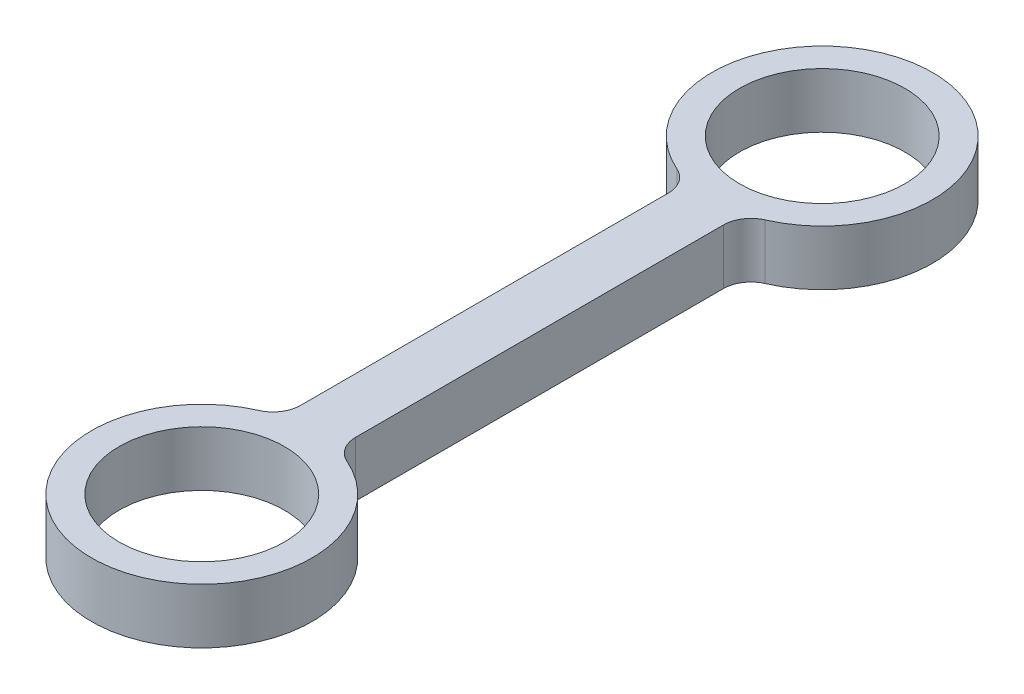
ISO-10303-21;
HEADER;
FILE_DESCRIPTION(('STEP AP214'),'2;1');
FILE_NAME('part.step','',(''),(''),'','','');
FILE_SCHEMA(('AUTOMOTIVE_DESIGN { 1 0 10303 214 1 1 1 1 }'));
ENDSEC;
DATA;
#1=APPLICATION_CONTEXT('core data for automotive mechanical design processes');
#2=APPLICATION_PROTOCOL_DEFINITION('international standard','automotive_design',2000,#1);
#3=PRODUCT_CONTEXT('',#1,'mechanical');
#4=PRODUCT('Part','Part','',(#3));
#5=PRODUCT_RELATED_PRODUCT_CATEGORY('part','',(#4));
#6=PRODUCT_DEFINITION_FORMATION('','',#4);
#7=PRODUCT_DEFINITION_CONTEXT('part definition',#1,'design');
#8=PRODUCT_DEFINITION('design','',#6,#7);
#9=PRODUCT_DEFINITION_SHAPE('','',#8);
#10=(LENGTH_UNIT() NAMED_UNIT(*) SI_UNIT(.MILLI.,.METRE.));
#11=(NAMED_UNIT(*) PLANE_ANGLE_UNIT() SI_UNIT($,.RADIAN.));
#12=(NAMED_UNIT(*) SI_UNIT($,.STERADIAN.) SOLID_ANGLE_UNIT());
#13=UNCERTAINTY_MEASURE_WITH_UNIT(LENGTH_MEASURE(1.E-05),#10,'distance_accuracy_value','');
#14=(GEOMETRIC_REPRESENTATION_CONTEXT(3) GLOBAL_UNCERTAINTY_ASSIGNED_CONTEXT((#13)) GLOBAL_UNIT_ASSIGNED_CONTEXT((#10,
#11,#12)) REPRESENTATION_CONTEXT('',''));
#15=CARTESIAN_POINT('',(0.,0.,0.));
#16=DIRECTION('',(0.,0.,1.));
#17=DIRECTION('',(1.,0.,0.));
#18=AXIS2_PLACEMENT_3D('',#15,#16,#17);
#19=CARTESIAN_POINT('',(0.,2.,-11.25));
#20=DIRECTION('',(0.,-1.,0.));
#21=DIRECTION('',(0.,0.,-1.));
#22=AXIS2_PLACEMENT_3D('',#19,#20,#21);
#23=CYLINDRICAL_SURFACE('',#22,4.);
#24=CARTESIAN_POINT('',(0.,2.,-11.25));
#25=DIRECTION('',(0.,1.,0.));
#26=DIRECTION('',(0.,0.,1.));
#27=AXIS2_PLACEMENT_3D('',#24,#25,#26);
#28=CIRCLE('',#27,4.);
#29=CARTESIAN_POINT('',(1.6,2.,-7.58393944403533));
#30=VERTEX_POINT('',#29);
#31=CARTESIAN_POINT('',(-1.6,2.,-7.58393944403533));
#32=VERTEX_POINT('',#31);
#33=EDGE_CURVE('E195',#30,#32,#28,.T.);
#34=ORIENTED_EDGE('',*,*,#33,.F.);
#35=DIRECTION('',(0.,-1.,0.));
#36=VECTOR('',#35,1.);
#37=CARTESIAN_POINT('',(1.6,2.,-7.58393944403533));
#38=LINE('',#37,#36);
#39=CARTESIAN_POINT('',(1.6,0.,-7.58393944403533));
#40=VERTEX_POINT('',#39);
#41=EDGE_CURVE('E163',#30,#40,#38,.T.);
#42=ORIENTED_EDGE('',*,*,#41,.T.);
#43=CARTESIAN_POINT('',(0.,0.,-11.25));
#44=DIRECTION('',(0.,1.,0.));
#45=DIRECTION('',(0.,0.,1.));
#46=AXIS2_PLACEMENT_3D('',#43,#44,#45);
#47=CIRCLE('',#46,4.);
#48=CARTESIAN_POINT('',(-1.6,0.,-7.58393944403533));
#49=VERTEX_POINT('',#48);
#50=EDGE_CURVE('E180',#40,#49,#47,.T.);
#51=ORIENTED_EDGE('',*,*,#50,.T.);
#52=DIRECTION('',(0.,-1.,0.));
#53=VECTOR('',#52,1.);
#54=CARTESIAN_POINT('',(-1.6,2.,-7.58393944403533));
#55=LINE('',#54,#53);
#56=EDGE_CURVE('E55',#49,#32,#55,.F.);
#57=ORIENTED_EDGE('',*,*,#56,.T.);
#58=EDGE_LOOP('',(#34,#42,#51,#57));
#59=FACE_BOUND('',#58,.T.);
#60=ADVANCED_FACE('F39',(#59),#23,.T.);
#61=CARTESIAN_POINT('',(-1.,2.,0.));
#62=DIRECTION('',(-1.,0.,0.));
#63=DIRECTION('',(0.,0.,1.));
#64=AXIS2_PLACEMENT_3D('',#61,#62,#63);
#65=PLANE('',#64);
#66=DIRECTION('',(0.,0.,-1.));
#67=VECTOR('',#66,1.);
#68=CARTESIAN_POINT('',(-1.,0.,0.));
#69=LINE('',#68,#67);
#70=CARTESIAN_POINT('',(-1.,0.,6.66742430504417));
#71=VERTEX_POINT('',#70);
#72=CARTESIAN_POINT('',(-1.,0.,-6.66742430504416));
#73=VERTEX_POINT('',#72);
#74=EDGE_CURVE('E131',#71,#73,#69,.T.);
#75=ORIENTED_EDGE('',*,*,#74,.F.);
#76=DIRECTION('',(0.,1.,0.));
#77=VECTOR('',#76,1.);
#78=CARTESIAN_POINT('',(-1.,2.,6.66742430504417));
#79=LINE('',#78,#77);
#80=CARTESIAN_POINT('',(-1.,2.,6.66742430504417));
#81=VERTEX_POINT('',#80);
#82=EDGE_CURVE('E152',#71,#81,#79,.T.);
#83=ORIENTED_EDGE('',*,*,#82,.T.);
#84=DIRECTION('',(0.,0.,-1.));
#85=VECTOR('',#84,1.);
#86=CARTESIAN_POINT('',(-1.,2.,0.));
#87=LINE('',#86,#85);
#88=CARTESIAN_POINT('',(-1.,2.,-6.66742430504416));
#89=VERTEX_POINT('',#88);
#90=EDGE_CURVE('E193',#81,#89,#87,.T.);
#91=ORIENTED_EDGE('',*,*,#90,.T.);
#92=DIRECTION('',(0.,-1.,0.));
#93=VECTOR('',#92,1.);
#94=CARTESIAN_POINT('',(-1.,2.,-6.66742430504416));
#95=LINE('',#94,#93);
#96=EDGE_CURVE('E140',#89,#73,#95,.T.);
#97=ORIENTED_EDGE('',*,*,#96,.T.);
#98=EDGE_LOOP('',(#75,#83,#91,#97));
#99=FACE_BOUND('',#98,.T.);
#100=ADVANCED_FACE('F197',(#99),#65,.T.);
#101=CARTESIAN_POINT('',(0.,2.,11.25));
#102=DIRECTION('',(0.,-1.,0.));
#103=DIRECTION('',(0.,0.,-1.));
#104=AXIS2_PLACEMENT_3D('',#101,#102,#103);
#105=CYLINDRICAL_SURFACE('',#104,4.);
#106=CARTESIAN_POINT('',(0.,2.,11.25));
#107=DIRECTION('',(0.,1.,0.));
#108=DIRECTION('',(0.,0.,1.));
#109=AXIS2_PLACEMENT_3D('',#106,#107,#108);
#110=CIRCLE('',#109,4.);
#111=CARTESIAN_POINT('',(1.6,2.,7.58393944403533));
#112=VERTEX_POINT('',#111);
#113=CARTESIAN_POINT('',(-1.6,2.,7.58393944403533));
#114=VERTEX_POINT('',#113);
#115=EDGE_CURVE('E200',#112,#114,#110,.F.);
#116=ORIENTED_EDGE('',*,*,#115,.T.);
#117=DIRECTION('',(0.,-1.,0.));
#118=VECTOR('',#117,1.);
#119=CARTESIAN_POINT('',(-1.6,2.,7.58393944403533));
#120=LINE('',#119,#118);
#121=CARTESIAN_POINT('',(-1.6,0.,7.58393944403533));
#122=VERTEX_POINT('',#121);
#123=EDGE_CURVE('E129',#114,#122,#120,.T.);
#124=ORIENTED_EDGE('',*,*,#123,.T.);
#125=CARTESIAN_POINT('',(0.,0.,11.25));
#126=DIRECTION('',(0.,1.,0.));
#127=DIRECTION('',(0.,0.,1.));
#128=AXIS2_PLACEMENT_3D('',#125,#126,#127);
#129=CIRCLE('',#128,4.);
#130=CARTESIAN_POINT('',(1.6,0.,7.58393944403533));
#131=VERTEX_POINT('',#130);
#132=EDGE_CURVE('E111',#131,#122,#129,.F.);
#133=ORIENTED_EDGE('',*,*,#132,.F.);
#134=DIRECTION('',(0.,-1.,0.));
#135=VECTOR('',#134,1.);
#136=CARTESIAN_POINT('',(1.6,2.,7.58393944403533));
#137=LINE('',#136,#135);
#138=EDGE_CURVE('E126',#131,#112,#137,.F.);
#139=ORIENTED_EDGE('',*,*,#138,.T.);
#140=EDGE_LOOP('',(#116,#124,#133,#139));
#141=FACE_BOUND('',#140,.T.);
#142=ADVANCED_FACE('F125',(#141),#105,.T.);
#143=CARTESIAN_POINT('',(1.,2.,0.));
#144=DIRECTION('',(-1.,0.,0.));
#145=DIRECTION('',(0.,0.,1.));
#146=AXIS2_PLACEMENT_3D('',#143,#144,#145);
#147=PLANE('',#146);
#148=DIRECTION('',(0.,0.,-1.));
#149=VECTOR('',#148,1.);
#150=CARTESIAN_POINT('',(1.,2.,0.));
#151=LINE('',#150,#149);
#152=CARTESIAN_POINT('',(1.,2.,6.66742430504417));
#153=VERTEX_POINT('',#152);
#154=CARTESIAN_POINT('',(1.,2.,-6.66742430504416));
#155=VERTEX_POINT('',#154);
#156=EDGE_CURVE('E143',#153,#155,#151,.T.);
#157=ORIENTED_EDGE('',*,*,#156,.F.);
#158=DIRECTION('',(0.,-1.,0.));
#159=VECTOR('',#158,1.);
#160=CARTESIAN_POINT('',(1.,2.,6.66742430504417));
#161=LINE('',#160,#159);
#162=CARTESIAN_POINT('',(1.,0.,6.66742430504417));
#163=VERTEX_POINT('',#162);
#164=EDGE_CURVE('E158',#153,#163,#161,.T.);
#165=ORIENTED_EDGE('',*,*,#164,.T.);
#166=DIRECTION('',(0.,0.,-1.));
#167=VECTOR('',#166,1.);
#168=CARTESIAN_POINT('',(1.,0.,0.));
#169=LINE('',#168,#167);
#170=CARTESIAN_POINT('',(1.,0.,-6.66742430504416));
#171=VERTEX_POINT('',#170);
#172=EDGE_CURVE('E113',#163,#171,#169,.T.);
#173=ORIENTED_EDGE('',*,*,#172,.T.);
#174=DIRECTION('',(0.,1.,0.));
#175=VECTOR('',#174,1.);
#176=CARTESIAN_POINT('',(1.,2.,-6.66742430504416));
#177=LINE('',#176,#175);
#178=EDGE_CURVE('E155',#171,#155,#177,.T.);
#179=ORIENTED_EDGE('',*,*,#178,.T.);
#180=EDGE_LOOP('',(#157,#165,#173,#179));
#181=FACE_BOUND('',#180,.T.);
#182=ADVANCED_FACE('F251',(#181),#147,.F.);
#183=CARTESIAN_POINT('',(0.,2.,-11.25));
#184=DIRECTION('',(0.,-1.,0.));
#185=DIRECTION('',(0.,0.,-1.));
#186=AXIS2_PLACEMENT_3D('',#183,#184,#185);
#187=CYLINDRICAL_SURFACE('',#186,3.);
#188=CARTESIAN_POINT('',(0.,2.,-11.25));
#189=DIRECTION('',(0.,1.,0.));
#190=DIRECTION('',(0.,0.,1.));
#191=AXIS2_PLACEMENT_3D('',#188,#189,#190);
#192=CIRCLE('',#191,3.);
#193=CARTESIAN_POINT('',(0.,2.,-8.25));
#194=VERTEX_POINT('',#193);
#195=EDGE_CURVE('E205',#194,#194,#192,.T.);
#196=ORIENTED_EDGE('',*,*,#195,.T.);
#197=EDGE_LOOP('',(#196));
#198=FACE_BOUND('',#197,.T.);
#199=CARTESIAN_POINT('',(0.,0.,-11.25));
#200=DIRECTION('',(0.,1.,0.));
#201=DIRECTION('',(0.,0.,1.));
#202=AXIS2_PLACEMENT_3D('',#199,#200,#201);
#203=CIRCLE('',#202,3.);
#204=CARTESIAN_POINT('',(0.,0.,-8.25));
#205=VERTEX_POINT('',#204);
#206=EDGE_CURVE('E186',#205,#205,#203,.T.);
#207=ORIENTED_EDGE('',*,*,#206,.F.);
#208=EDGE_LOOP('',(#207));
#209=FACE_BOUND('',#208,.T.);
#210=ADVANCED_FACE('F226',(#198,#209),#187,.F.);
#211=CARTESIAN_POINT('',(0.,2.,11.25));
#212=DIRECTION('',(0.,-1.,0.));
#213=DIRECTION('',(0.,0.,-1.));
#214=AXIS2_PLACEMENT_3D('',#211,#212,#213);
#215=CYLINDRICAL_SURFACE('',#214,3.);
#216=CARTESIAN_POINT('',(0.,2.,11.25));
#217=DIRECTION('',(0.,1.,0.));
#218=DIRECTION('',(0.,0.,1.));
#219=AXIS2_PLACEMENT_3D('',#216,#217,#218);
#220=CIRCLE('',#219,3.);
#221=CARTESIAN_POINT('',(0.,2.,14.25));
#222=VERTEX_POINT('',#221);
#223=EDGE_CURVE('E136',#222,#222,#220,.F.);
#224=ORIENTED_EDGE('',*,*,#223,.F.);
#225=EDGE_LOOP('',(#224));
#226=FACE_BOUND('',#225,.T.);
#227=CARTESIAN_POINT('',(0.,0.,11.25));
#228=DIRECTION('',(0.,1.,0.));
#229=DIRECTION('',(0.,0.,1.));
#230=AXIS2_PLACEMENT_3D('',#227,#228,#229);
#231=CIRCLE('',#230,3.);
#232=CARTESIAN_POINT('',(0.,0.,14.25));
#233=VERTEX_POINT('',#232);
#234=EDGE_CURVE('E146',#233,#233,#231,.F.);
#235=ORIENTED_EDGE('',*,*,#234,.T.);
#236=EDGE_LOOP('',(#235));
#237=FACE_BOUND('',#236,.T.);
#238=ADVANCED_FACE('F230',(#226,#237),#215,.F.);
#239=CARTESIAN_POINT('',(0.,2.,0.));
#240=DIRECTION('',(0.,1.,0.));
#241=DIRECTION('',(0.,0.,1.));
#242=AXIS2_PLACEMENT_3D('',#239,#240,#241);
#243=PLANE('',#242);
#244=ORIENTED_EDGE('',*,*,#195,.F.);
#245=EDGE_LOOP('',(#244));
#246=FACE_BOUND('',#245,.T.);
#247=ORIENTED_EDGE('',*,*,#156,.T.);
#248=CARTESIAN_POINT('',(2.,2.,-6.66742430504416));
#249=DIRECTION('',(0.,1.,0.));
#250=DIRECTION('',(0.,0.,1.));
#251=AXIS2_PLACEMENT_3D('',#248,#249,#250);
#252=CIRCLE('',#251,1.);
#253=EDGE_CURVE('E62',#155,#30,#252,.F.);
#254=ORIENTED_EDGE('',*,*,#253,.T.);
#255=ORIENTED_EDGE('',*,*,#33,.T.);
#256=CARTESIAN_POINT('',(-2.,2.,-6.66742430504416));
#257=DIRECTION('',(0.,1.,0.));
#258=DIRECTION('',(0.,0.,1.));
#259=AXIS2_PLACEMENT_3D('',#256,#257,#258);
#260=CIRCLE('',#259,1.);
#261=EDGE_CURVE('E11',#32,#89,#260,.F.);
#262=ORIENTED_EDGE('',*,*,#261,.T.);
#263=ORIENTED_EDGE('',*,*,#90,.F.);
#264=CARTESIAN_POINT('',(-2.,2.,6.66742430504417));
#265=DIRECTION('',(0.,1.,0.));
#266=DIRECTION('',(0.,0.,1.));
#267=AXIS2_PLACEMENT_3D('',#264,#265,#266);
#268=CIRCLE('',#267,1.);
#269=EDGE_CURVE('E120',#81,#114,#268,.F.);
#270=ORIENTED_EDGE('',*,*,#269,.T.);
#271=ORIENTED_EDGE('',*,*,#115,.F.);
#272=CARTESIAN_POINT('',(2.,2.,6.66742430504417));
#273=DIRECTION('',(0.,1.,0.));
#274=DIRECTION('',(0.,0.,1.));
#275=AXIS2_PLACEMENT_3D('',#272,#273,#274);
#276=CIRCLE('',#275,1.);
#277=EDGE_CURVE('E119',#112,#153,#276,.F.);
#278=ORIENTED_EDGE('',*,*,#277,.T.);
#279=EDGE_LOOP('',(#247,#254,#255,#262,#263,#270,#271,#278));
#280=FACE_BOUND('',#279,.T.);
#281=ORIENTED_EDGE('',*,*,#223,.T.);
#282=EDGE_LOOP('',(#281));
#283=FACE_BOUND('',#282,.T.);
#284=ADVANCED_FACE('F191',(#246,#280,#283),#243,.T.);
#285=CARTESIAN_POINT('',(0.,0.,0.));
#286=DIRECTION('',(0.,1.,0.));
#287=DIRECTION('',(0.,0.,1.));
#288=AXIS2_PLACEMENT_3D('',#285,#286,#287);
#289=PLANE('',#288);
#290=ORIENTED_EDGE('',*,*,#206,.T.);
#291=EDGE_LOOP('',(#290));
#292=FACE_BOUND('',#291,.T.);
#293=ORIENTED_EDGE('',*,*,#50,.F.);
#294=CARTESIAN_POINT('',(2.,0.,-6.66742430504416));
#295=DIRECTION('',(0.,1.,0.));
#296=DIRECTION('',(0.,0.,1.));
#297=AXIS2_PLACEMENT_3D('',#294,#295,#296);
#298=CIRCLE('',#297,1.);
#299=EDGE_CURVE('E174',#40,#171,#298,.T.);
#300=ORIENTED_EDGE('',*,*,#299,.T.);
#301=ORIENTED_EDGE('',*,*,#172,.F.);
#302=CARTESIAN_POINT('',(2.,0.,6.66742430504417));
#303=DIRECTION('',(0.,1.,0.));
#304=DIRECTION('',(0.,0.,1.));
#305=AXIS2_PLACEMENT_3D('',#302,#303,#304);
#306=CIRCLE('',#305,1.);
#307=EDGE_CURVE('E106',#163,#131,#306,.T.);
#308=ORIENTED_EDGE('',*,*,#307,.T.);
#309=ORIENTED_EDGE('',*,*,#132,.T.);
#310=CARTESIAN_POINT('',(-2.,0.,6.66742430504417));
#311=DIRECTION('',(0.,1.,0.));
#312=DIRECTION('',(0.,0.,1.));
#313=AXIS2_PLACEMENT_3D('',#310,#311,#312);
#314=CIRCLE('',#313,1.);
#315=EDGE_CURVE('E167',#122,#71,#314,.T.);
#316=ORIENTED_EDGE('',*,*,#315,.T.);
#317=ORIENTED_EDGE('',*,*,#74,.T.);
#318=CARTESIAN_POINT('',(-2.,0.,-6.66742430504416));
#319=DIRECTION('',(0.,1.,0.));
#320=DIRECTION('',(0.,0.,1.));
#321=AXIS2_PLACEMENT_3D('',#318,#319,#320);
#322=CIRCLE('',#321,1.);
#323=EDGE_CURVE('E48',#73,#49,#322,.T.);
#324=ORIENTED_EDGE('',*,*,#323,.T.);
#325=EDGE_LOOP('',(#293,#300,#301,#308,#309,#316,#317,#324));
#326=FACE_BOUND('',#325,.T.);
#327=ORIENTED_EDGE('',*,*,#234,.F.);
#328=EDGE_LOOP('',(#327));
#329=FACE_BOUND('',#328,.T.);
#330=ADVANCED_FACE('F109',(#292,#326,#329),#289,.F.);
#331=CARTESIAN_POINT('',(-2.,2.,6.66742430504417));
#332=DIRECTION('',(0.,-1.,0.));
#333=DIRECTION('',(0.,0.,-1.));
#334=AXIS2_PLACEMENT_3D('',#331,#332,#333);
#335=CYLINDRICAL_SURFACE('',#334,1.);
#336=ORIENTED_EDGE('',*,*,#269,.F.);
#337=ORIENTED_EDGE('',*,*,#82,.F.);
#338=ORIENTED_EDGE('',*,*,#315,.F.);
#339=ORIENTED_EDGE('',*,*,#123,.F.);
#340=EDGE_LOOP('',(#336,#337,#338,#339));
#341=FACE_BOUND('',#340,.T.);
#342=ADVANCED_FACE('F236',(#341),#335,.F.);
#343=CARTESIAN_POINT('',(2.,2.,6.66742430504417));
#344=DIRECTION('',(0.,-1.,0.));
#345=DIRECTION('',(0.,0.,-1.));
#346=AXIS2_PLACEMENT_3D('',#343,#344,#345);
#347=CYLINDRICAL_SURFACE('',#346,1.);
#348=ORIENTED_EDGE('',*,*,#277,.F.);
#349=ORIENTED_EDGE('',*,*,#138,.F.);
#350=ORIENTED_EDGE('',*,*,#307,.F.);
#351=ORIENTED_EDGE('',*,*,#164,.F.);
#352=EDGE_LOOP('',(#348,#349,#350,#351));
#353=FACE_BOUND('',#352,.T.);
#354=ADVANCED_FACE('F134',(#353),#347,.F.);
#355=CARTESIAN_POINT('',(2.,2.,-6.66742430504416));
#356=DIRECTION('',(0.,-1.,0.));
#357=DIRECTION('',(0.,0.,-1.));
#358=AXIS2_PLACEMENT_3D('',#355,#356,#357);
#359=CYLINDRICAL_SURFACE('',#358,1.);
#360=ORIENTED_EDGE('',*,*,#253,.F.);
#361=ORIENTED_EDGE('',*,*,#178,.F.);
#362=ORIENTED_EDGE('',*,*,#299,.F.);
#363=ORIENTED_EDGE('',*,*,#41,.F.);
#364=EDGE_LOOP('',(#360,#361,#362,#363));
#365=FACE_BOUND('',#364,.T.);
#366=ADVANCED_FACE('F256',(#365),#359,.F.);
#367=CARTESIAN_POINT('',(-2.,2.,-6.66742430504416));
#368=DIRECTION('',(0.,-1.,0.));
#369=DIRECTION('',(0.,0.,-1.));
#370=AXIS2_PLACEMENT_3D('',#367,#368,#369);
#371=CYLINDRICAL_SURFACE('',#370,1.);
#372=ORIENTED_EDGE('',*,*,#261,.F.);
#373=ORIENTED_EDGE('',*,*,#56,.F.);
#374=ORIENTED_EDGE('',*,*,#323,.F.);
#375=ORIENTED_EDGE('',*,*,#96,.F.);
#376=EDGE_LOOP('',(#372,#373,#374,#375));
#377=FACE_BOUND('',#376,.T.);
#378=ADVANCED_FACE('F41',(#377),#371,.F.);
#379=CLOSED_SHELL('',(#60,#100,#142,#182,#210,#238,#284,#330,#342,#354,#366,#378));
#380=MANIFOLD_SOLID_BREP('B2',#379);
#381=ADVANCED_BREP_SHAPE_REPRESENTATION('',(#18,#380),#14);
#382=SHAPE_DEFINITION_REPRESENTATION(#9,#381);
ENDSEC;
END-ISO-10303-21;
